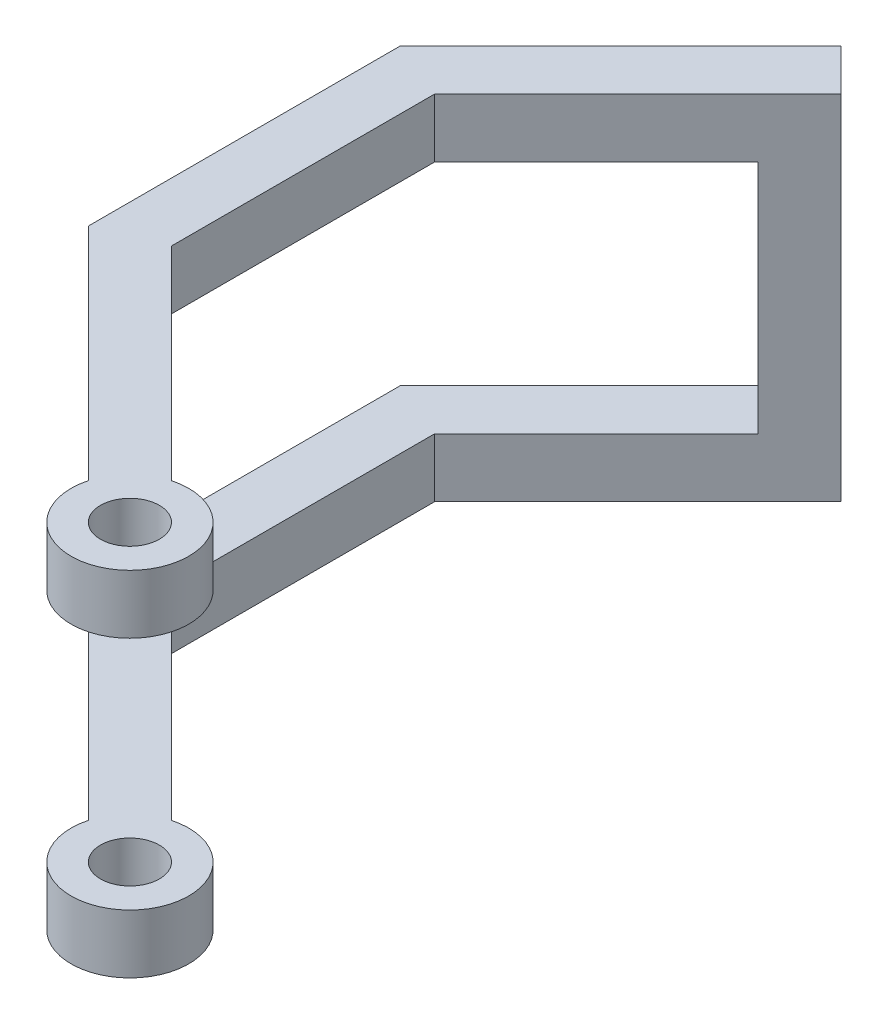
ISO-10303-21;
HEADER;
FILE_DESCRIPTION(('STEP AP214'),'2;1');
FILE_NAME('part.step','',(''),(''),'','','');
FILE_SCHEMA(('AUTOMOTIVE_DESIGN { 1 0 10303 214 1 1 1 1 }'));
ENDSEC;
DATA;
#1=APPLICATION_CONTEXT('core data for automotive mechanical design processes');
#2=APPLICATION_PROTOCOL_DEFINITION('international standard','automotive_design',2000,#1);
#3=PRODUCT_CONTEXT('',#1,'mechanical');
#4=PRODUCT('Part','Part','',(#3));
#5=PRODUCT_RELATED_PRODUCT_CATEGORY('part','',(#4));
#6=PRODUCT_DEFINITION_FORMATION('','',#4);
#7=PRODUCT_DEFINITION_CONTEXT('part definition',#1,'design');
#8=PRODUCT_DEFINITION('design','',#6,#7);
#9=PRODUCT_DEFINITION_SHAPE('','',#8);
#10=(LENGTH_UNIT() NAMED_UNIT(*) SI_UNIT(.MILLI.,.METRE.));
#11=(NAMED_UNIT(*) PLANE_ANGLE_UNIT() SI_UNIT($,.RADIAN.));
#12=(NAMED_UNIT(*) SI_UNIT($,.STERADIAN.) SOLID_ANGLE_UNIT());
#13=UNCERTAINTY_MEASURE_WITH_UNIT(LENGTH_MEASURE(1.E-05),#10,'distance_accuracy_value','');
#14=(GEOMETRIC_REPRESENTATION_CONTEXT(3) GLOBAL_UNCERTAINTY_ASSIGNED_CONTEXT((#13)) GLOBAL_UNIT_ASSIGNED_CONTEXT((#10,
#11,#12)) REPRESENTATION_CONTEXT('',''));
#15=CARTESIAN_POINT('',(0.,0.,0.));
#16=DIRECTION('',(0.,0.,1.));
#17=DIRECTION('',(1.,0.,0.));
#18=AXIS2_PLACEMENT_3D('',#15,#16,#17);
#19=CARTESIAN_POINT('',(9.65925826289067,60.,2.58819045102526));
#20=DIRECTION('',(0.,1.,0.));
#21=DIRECTION('',(0.,0.,1.));
#22=AXIS2_PLACEMENT_3D('',#19,#20,#21);
#23=PLANE('',#22);
#24=CARTESIAN_POINT('',(9.65925826289067,60.,2.58819045102526));
#25=DIRECTION('',(0.,1.,0.));
#26=DIRECTION('',(0.,0.,1.));
#27=AXIS2_PLACEMENT_3D('',#24,#25,#26);
#28=CIRCLE('',#27,10.);
#29=CARTESIAN_POINT('',(0.,60.,0.));
#30=VERTEX_POINT('',#29);
#31=CARTESIAN_POINT('',(7.07106781186551,60.,-7.07106781186544));
#32=VERTEX_POINT('',#31);
#33=EDGE_CURVE('E196',#30,#32,#28,.T.);
#34=ORIENTED_EDGE('',*,*,#33,.T.);
#35=DIRECTION('',(-0.707106781186549,0.,-0.707106781186546));
#36=VECTOR('',#35,1.);
#37=CARTESIAN_POINT('',(7.07106781186551,60.,-7.07106781186544));
#38=LINE('',#37,#36);
#39=CARTESIAN_POINT('',(-27.4766594028869,60.,-41.6187950266178));
#40=VERTEX_POINT('',#39);
#41=EDGE_CURVE('E213',#32,#40,#38,.T.);
#42=ORIENTED_EDGE('',*,*,#41,.T.);
#43=DIRECTION('',(0.,0.,-1.));
#44=VECTOR('',#43,1.);
#45=CARTESIAN_POINT('',(-27.4766594028869,60.,-41.6187950266178));
#46=LINE('',#45,#44);
#47=CARTESIAN_POINT('',(-27.4766594028869,60.,-86.3345237791561));
#48=VERTEX_POINT('',#47);
#49=EDGE_CURVE('E211',#40,#48,#46,.T.);
#50=ORIENTED_EDGE('',*,*,#49,.T.);
#51=DIRECTION('',(0.707106781186549,0.,-0.707106781186547));
#52=VECTOR('',#51,1.);
#53=CARTESIAN_POINT('',(7.07106781186563,60.,-120.882250993909));
#54=LINE('',#53,#52);
#55=CARTESIAN_POINT('',(7.07106781186563,60.,-120.882250993909));
#56=VERTEX_POINT('',#55);
#57=EDGE_CURVE('E209',#48,#56,#54,.T.);
#58=ORIENTED_EDGE('',*,*,#57,.T.);
#59=DIRECTION('',(-0.707106781186546,0.,-0.707106781186549));
#60=VECTOR('',#59,1.);
#61=CARTESIAN_POINT('',(1.66533453693774E-13,60.,-127.953318805774));
#62=LINE('',#61,#60);
#63=CARTESIAN_POINT('',(1.66533453693774E-13,60.,-127.953318805774));
#64=VERTEX_POINT('',#63);
#65=EDGE_CURVE('E207',#56,#64,#62,.T.);
#66=ORIENTED_EDGE('',*,*,#65,.T.);
#67=DIRECTION('',(-0.707106781186549,0.,0.707106781186546));
#68=VECTOR('',#67,1.);
#69=CARTESIAN_POINT('',(-37.4766594028869,60.,-90.4766594028871));
#70=LINE('',#69,#68);
#71=CARTESIAN_POINT('',(-37.4766594028869,60.,-90.4766594028871));
#72=VERTEX_POINT('',#71);
#73=EDGE_CURVE('E205',#64,#72,#70,.T.);
#74=ORIENTED_EDGE('',*,*,#73,.T.);
#75=DIRECTION('',(0.,0.,1.));
#76=VECTOR('',#75,1.);
#77=CARTESIAN_POINT('',(-37.476659402887,60.,-37.4766594028871));
#78=LINE('',#77,#76);
#79=CARTESIAN_POINT('',(-37.476659402887,60.,-37.4766594028871));
#80=VERTEX_POINT('',#79);
#81=EDGE_CURVE('E203',#72,#80,#78,.T.);
#82=ORIENTED_EDGE('',*,*,#81,.T.);
#83=DIRECTION('',(0.707106781186546,0.,0.707106781186549));
#84=VECTOR('',#83,1.);
#85=CARTESIAN_POINT('',(0.,60.,0.));
#86=LINE('',#85,#84);
#87=EDGE_CURVE('E200',#80,#30,#86,.T.);
#88=ORIENTED_EDGE('',*,*,#87,.T.);
#89=EDGE_LOOP('',(#34,#42,#50,#58,#66,#74,#82,#88));
#90=FACE_BOUND('',#89,.T.);
#91=CARTESIAN_POINT('',(9.65925826289067,60.,2.58819045102526));
#92=DIRECTION('',(0.,1.,0.));
#93=DIRECTION('',(0.,0.,1.));
#94=AXIS2_PLACEMENT_3D('',#91,#92,#93);
#95=CIRCLE('',#94,5.);
#96=CARTESIAN_POINT('',(9.65925826289067,60.,7.58819045102526));
#97=VERTEX_POINT('',#96);
#98=EDGE_CURVE('E199',#97,#97,#95,.T.);
#99=ORIENTED_EDGE('',*,*,#98,.F.);
#100=EDGE_LOOP('',(#99));
#101=FACE_BOUND('',#100,.T.);
#102=ADVANCED_FACE('F35',(#90,#101),#23,.T.);
#103=CARTESIAN_POINT('',(9.65925826289067,60.,2.58819045102526));
#104=DIRECTION('',(0.,-1.,0.));
#105=DIRECTION('',(0.,0.,-1.));
#106=AXIS2_PLACEMENT_3D('',#103,#104,#105);
#107=CYLINDRICAL_SURFACE('',#106,10.);
#108=CARTESIAN_POINT('',(9.65925826289067,50.,2.58819045102526));
#109=DIRECTION('',(0.,1.,0.));
#110=DIRECTION('',(0.,0.,1.));
#111=AXIS2_PLACEMENT_3D('',#108,#109,#110);
#112=CIRCLE('',#111,10.);
#113=CARTESIAN_POINT('',(0.,50.,0.));
#114=VERTEX_POINT('',#113);
#115=CARTESIAN_POINT('',(7.07106781186551,50.,-7.07106781186544));
#116=VERTEX_POINT('',#115);
#117=EDGE_CURVE('E202',#114,#116,#112,.T.);
#118=ORIENTED_EDGE('',*,*,#117,.T.);
#119=DIRECTION('',(0.,-1.,0.));
#120=VECTOR('',#119,1.);
#121=CARTESIAN_POINT('',(7.07106781186551,60.,-7.07106781186544));
#122=LINE('',#121,#120);
#123=EDGE_CURVE('E235',#32,#116,#122,.T.);
#124=ORIENTED_EDGE('',*,*,#123,.F.);
#125=ORIENTED_EDGE('',*,*,#33,.F.);
#126=DIRECTION('',(0.,-1.,0.));
#127=VECTOR('',#126,1.);
#128=CARTESIAN_POINT('',(0.,60.,0.));
#129=LINE('',#128,#127);
#130=EDGE_CURVE('E39',#30,#114,#129,.T.);
#131=ORIENTED_EDGE('',*,*,#130,.T.);
#132=EDGE_LOOP('',(#118,#124,#125,#131));
#133=FACE_BOUND('',#132,.T.);
#134=ADVANCED_FACE('F265',(#133),#107,.T.);
#135=CARTESIAN_POINT('',(7.07106781186551,60.,-7.07106781186544));
#136=DIRECTION('',(-0.707106781186546,0.,0.707106781186549));
#137=DIRECTION('',(0.707106781186549,0.,0.707106781186546));
#138=AXIS2_PLACEMENT_3D('',#135,#136,#137);
#139=PLANE('',#138);
#140=ORIENTED_EDGE('',*,*,#123,.T.);
#141=DIRECTION('',(-0.707106781186549,0.,-0.707106781186546));
#142=VECTOR('',#141,1.);
#143=CARTESIAN_POINT('',(7.07106781186551,50.,-7.07106781186544));
#144=LINE('',#143,#142);
#145=CARTESIAN_POINT('',(-27.4766594028869,50.,-41.6187950266178));
#146=VERTEX_POINT('',#145);
#147=EDGE_CURVE('E232',#116,#146,#144,.T.);
#148=ORIENTED_EDGE('',*,*,#147,.T.);
#149=DIRECTION('',(0.,-1.,0.));
#150=VECTOR('',#149,1.);
#151=CARTESIAN_POINT('',(-27.4766594028869,60.,-41.6187950266178));
#152=LINE('',#151,#150);
#153=EDGE_CURVE('E231',#40,#146,#152,.T.);
#154=ORIENTED_EDGE('',*,*,#153,.F.);
#155=ORIENTED_EDGE('',*,*,#41,.F.);
#156=EDGE_LOOP('',(#140,#148,#154,#155));
#157=FACE_BOUND('',#156,.T.);
#158=ADVANCED_FACE('F340',(#157),#139,.F.);
#159=CARTESIAN_POINT('',(-27.4766594028869,60.,-41.6187950266178));
#160=DIRECTION('',(-1.,0.,0.));
#161=DIRECTION('',(0.,0.,1.));
#162=AXIS2_PLACEMENT_3D('',#159,#160,#161);
#163=PLANE('',#162);
#164=ORIENTED_EDGE('',*,*,#153,.T.);
#165=DIRECTION('',(0.,0.,-1.));
#166=VECTOR('',#165,1.);
#167=CARTESIAN_POINT('',(-27.4766594028869,50.,-41.6187950266178));
#168=LINE('',#167,#166);
#169=CARTESIAN_POINT('',(-27.4766594028869,50.,-86.3345237791561));
#170=VERTEX_POINT('',#169);
#171=EDGE_CURVE('E228',#146,#170,#168,.T.);
#172=ORIENTED_EDGE('',*,*,#171,.T.);
#173=DIRECTION('',(0.,-1.,0.));
#174=VECTOR('',#173,1.);
#175=CARTESIAN_POINT('',(-27.4766594028869,60.,-86.3345237791561));
#176=LINE('',#175,#174);
#177=EDGE_CURVE('E227',#48,#170,#176,.T.);
#178=ORIENTED_EDGE('',*,*,#177,.F.);
#179=ORIENTED_EDGE('',*,*,#49,.F.);
#180=EDGE_LOOP('',(#164,#172,#178,#179));
#181=FACE_BOUND('',#180,.T.);
#182=ADVANCED_FACE('F337',(#181),#163,.F.);
#183=CARTESIAN_POINT('',(7.07106781186563,60.,-120.882250993909));
#184=DIRECTION('',(-0.707106781186547,0.,-0.707106781186549));
#185=DIRECTION('',(-0.707106781186549,0.,0.707106781186547));
#186=AXIS2_PLACEMENT_3D('',#183,#184,#185);
#187=PLANE('',#186);
#188=ORIENTED_EDGE('',*,*,#177,.T.);
#189=DIRECTION('',(0.707106781186549,0.,-0.707106781186547));
#190=VECTOR('',#189,1.);
#191=CARTESIAN_POINT('',(7.07106781186563,50.,-120.882250993909));
#192=LINE('',#191,#190);
#193=CARTESIAN_POINT('',(0.,50.,-113.811183182043));
#194=VERTEX_POINT('',#193);
#195=EDGE_CURVE('E223',#170,#194,#192,.T.);
#196=ORIENTED_EDGE('',*,*,#195,.T.);
#197=DIRECTION('',(0.,-1.,0.));
#198=VECTOR('',#197,1.);
#199=CARTESIAN_POINT('',(0.,50.,-113.811183182043));
#200=LINE('',#199,#198);
#201=CARTESIAN_POINT('',(0.,10.,-113.811183182043));
#202=VERTEX_POINT('',#201);
#203=EDGE_CURVE('E52',#194,#202,#200,.T.);
#204=ORIENTED_EDGE('',*,*,#203,.T.);
#205=DIRECTION('',(0.707106781186549,0.,-0.707106781186547));
#206=VECTOR('',#205,1.);
#207=CARTESIAN_POINT('',(7.07106781186563,10.,-120.882250993909));
#208=LINE('',#207,#206);
#209=CARTESIAN_POINT('',(-27.4766594028869,10.,-86.3345237791561));
#210=VERTEX_POINT('',#209);
#211=EDGE_CURVE('E161',#210,#202,#208,.T.);
#212=ORIENTED_EDGE('',*,*,#211,.F.);
#213=DIRECTION('',(0.,-1.,0.));
#214=VECTOR('',#213,1.);
#215=CARTESIAN_POINT('',(-27.4766594028869,60.,-86.3345237791561));
#216=LINE('',#215,#214);
#217=CARTESIAN_POINT('',(-27.4766594028869,0.,-86.3345237791561));
#218=VERTEX_POINT('',#217);
#219=EDGE_CURVE('E176',#210,#218,#216,.T.);
#220=ORIENTED_EDGE('',*,*,#219,.T.);
#221=DIRECTION('',(0.707106781186549,0.,-0.707106781186547));
#222=VECTOR('',#221,1.);
#223=CARTESIAN_POINT('',(7.07106781186563,0.,-120.882250993909));
#224=LINE('',#223,#222);
#225=CARTESIAN_POINT('',(7.07106781186563,0.,-120.882250993909));
#226=VERTEX_POINT('',#225);
#227=EDGE_CURVE('E282',#218,#226,#224,.T.);
#228=ORIENTED_EDGE('',*,*,#227,.T.);
#229=DIRECTION('',(0.,-1.,0.));
#230=VECTOR('',#229,1.);
#231=CARTESIAN_POINT('',(7.07106781186563,60.,-120.882250993909));
#232=LINE('',#231,#230);
#233=EDGE_CURVE('E226',#56,#226,#232,.T.);
#234=ORIENTED_EDGE('',*,*,#233,.F.);
#235=ORIENTED_EDGE('',*,*,#57,.F.);
#236=EDGE_LOOP('',(#188,#196,#204,#212,#220,#228,#234,#235));
#237=FACE_BOUND('',#236,.T.);
#238=ADVANCED_FACE('F316',(#237),#187,.F.);
#239=CARTESIAN_POINT('',(1.66533453693774E-13,60.,-127.953318805774));
#240=DIRECTION('',(-0.707106781186549,0.,0.707106781186546));
#241=DIRECTION('',(0.707106781186546,0.,0.707106781186549));
#242=AXIS2_PLACEMENT_3D('',#239,#240,#241);
#243=PLANE('',#242);
#244=ORIENTED_EDGE('',*,*,#233,.T.);
#245=DIRECTION('',(-0.707106781186546,0.,-0.707106781186549));
#246=VECTOR('',#245,1.);
#247=CARTESIAN_POINT('',(1.66533453693774E-13,0.,-127.953318805774));
#248=LINE('',#247,#246);
#249=CARTESIAN_POINT('',(1.66533453693774E-13,0.,-127.953318805774));
#250=VERTEX_POINT('',#249);
#251=EDGE_CURVE('E276',#226,#250,#248,.T.);
#252=ORIENTED_EDGE('',*,*,#251,.T.);
#253=DIRECTION('',(0.,-1.,0.));
#254=VECTOR('',#253,1.);
#255=CARTESIAN_POINT('',(1.66533453693774E-13,60.,-127.953318805774));
#256=LINE('',#255,#254);
#257=EDGE_CURVE('E222',#64,#250,#256,.T.);
#258=ORIENTED_EDGE('',*,*,#257,.F.);
#259=ORIENTED_EDGE('',*,*,#65,.F.);
#260=EDGE_LOOP('',(#244,#252,#258,#259));
#261=FACE_BOUND('',#260,.T.);
#262=ADVANCED_FACE('F277',(#261),#243,.F.);
#263=CARTESIAN_POINT('',(-37.4766594028869,60.,-90.4766594028871));
#264=DIRECTION('',(0.707106781186546,0.,0.707106781186549));
#265=DIRECTION('',(0.707106781186549,0.,-0.707106781186546));
#266=AXIS2_PLACEMENT_3D('',#263,#264,#265);
#267=PLANE('',#266);
#268=ORIENTED_EDGE('',*,*,#257,.T.);
#269=DIRECTION('',(-0.707106781186549,0.,0.707106781186546));
#270=VECTOR('',#269,1.);
#271=CARTESIAN_POINT('',(-37.4766594028869,0.,-90.4766594028871));
#272=LINE('',#271,#270);
#273=CARTESIAN_POINT('',(-37.4766594028869,0.,-90.4766594028871));
#274=VERTEX_POINT('',#273);
#275=EDGE_CURVE('E174',#250,#274,#272,.T.);
#276=ORIENTED_EDGE('',*,*,#275,.T.);
#277=DIRECTION('',(0.,-1.,0.));
#278=VECTOR('',#277,1.);
#279=CARTESIAN_POINT('',(-37.4766594028869,60.,-90.4766594028871));
#280=LINE('',#279,#278);
#281=CARTESIAN_POINT('',(-37.4766594028869,10.,-90.4766594028871));
#282=VERTEX_POINT('',#281);
#283=EDGE_CURVE('E167',#282,#274,#280,.T.);
#284=ORIENTED_EDGE('',*,*,#283,.F.);
#285=DIRECTION('',(-0.707106781186549,0.,0.707106781186546));
#286=VECTOR('',#285,1.);
#287=CARTESIAN_POINT('',(-37.4766594028869,10.,-90.4766594028871));
#288=LINE('',#287,#286);
#289=CARTESIAN_POINT('',(-7.07106781186546,10.,-120.882250993908));
#290=VERTEX_POINT('',#289);
#291=EDGE_CURVE('E151',#290,#282,#288,.T.);
#292=ORIENTED_EDGE('',*,*,#291,.F.);
#293=DIRECTION('',(0.,-1.,0.));
#294=VECTOR('',#293,1.);
#295=CARTESIAN_POINT('',(-7.07106781186545,50.,-120.882250993908));
#296=LINE('',#295,#294);
#297=CARTESIAN_POINT('',(-7.07106781186545,50.,-120.882250993908));
#298=VERTEX_POINT('',#297);
#299=EDGE_CURVE('E194',#298,#290,#296,.T.);
#300=ORIENTED_EDGE('',*,*,#299,.F.);
#301=DIRECTION('',(-0.707106781186549,0.,0.707106781186546));
#302=VECTOR('',#301,1.);
#303=CARTESIAN_POINT('',(-37.4766594028869,50.,-90.4766594028871));
#304=LINE('',#303,#302);
#305=CARTESIAN_POINT('',(-37.4766594028869,50.,-90.4766594028871));
#306=VERTEX_POINT('',#305);
#307=EDGE_CURVE('E61',#298,#306,#304,.T.);
#308=ORIENTED_EDGE('',*,*,#307,.T.);
#309=DIRECTION('',(0.,-1.,0.));
#310=VECTOR('',#309,1.);
#311=CARTESIAN_POINT('',(-37.4766594028869,60.,-90.4766594028871));
#312=LINE('',#311,#310);
#313=EDGE_CURVE('E221',#72,#306,#312,.T.);
#314=ORIENTED_EDGE('',*,*,#313,.F.);
#315=ORIENTED_EDGE('',*,*,#73,.F.);
#316=EDGE_LOOP('',(#268,#276,#284,#292,#300,#308,#314,#315));
#317=FACE_BOUND('',#316,.T.);
#318=ADVANCED_FACE('F172',(#317),#267,.F.);
#319=CARTESIAN_POINT('',(-37.476659402887,60.,-37.4766594028871));
#320=DIRECTION('',(1.,0.,0.));
#321=DIRECTION('',(0.,0.,-1.));
#322=AXIS2_PLACEMENT_3D('',#319,#320,#321);
#323=PLANE('',#322);
#324=ORIENTED_EDGE('',*,*,#313,.T.);
#325=DIRECTION('',(0.,0.,-1.));
#326=VECTOR('',#325,1.);
#327=CARTESIAN_POINT('',(-37.476659402887,50.,0.));
#328=LINE('',#327,#326);
#329=CARTESIAN_POINT('',(-37.476659402887,50.,-37.4766594028871));
#330=VERTEX_POINT('',#329);
#331=EDGE_CURVE('E11',#330,#306,#328,.T.);
#332=ORIENTED_EDGE('',*,*,#331,.F.);
#333=DIRECTION('',(0.,-1.,0.));
#334=VECTOR('',#333,1.);
#335=CARTESIAN_POINT('',(-37.476659402887,60.,-37.4766594028871));
#336=LINE('',#335,#334);
#337=EDGE_CURVE('E238',#80,#330,#336,.T.);
#338=ORIENTED_EDGE('',*,*,#337,.F.);
#339=ORIENTED_EDGE('',*,*,#81,.F.);
#340=EDGE_LOOP('',(#324,#332,#338,#339));
#341=FACE_BOUND('',#340,.T.);
#342=ADVANCED_FACE('F259',(#341),#323,.F.);
#343=CARTESIAN_POINT('',(0.,60.,0.));
#344=DIRECTION('',(0.707106781186549,0.,-0.707106781186546));
#345=DIRECTION('',(-0.707106781186546,0.,-0.707106781186549));
#346=AXIS2_PLACEMENT_3D('',#343,#344,#345);
#347=PLANE('',#346);
#348=ORIENTED_EDGE('',*,*,#337,.T.);
#349=DIRECTION('',(0.707106781186546,0.,0.707106781186549));
#350=VECTOR('',#349,1.);
#351=CARTESIAN_POINT('',(0.,50.,0.));
#352=LINE('',#351,#350);
#353=EDGE_CURVE('E219',#330,#114,#352,.T.);
#354=ORIENTED_EDGE('',*,*,#353,.T.);
#355=ORIENTED_EDGE('',*,*,#130,.F.);
#356=ORIENTED_EDGE('',*,*,#87,.F.);
#357=EDGE_LOOP('',(#348,#354,#355,#356));
#358=FACE_BOUND('',#357,.T.);
#359=ADVANCED_FACE('F253',(#358),#347,.F.);
#360=CARTESIAN_POINT('',(9.65925826289067,60.,2.58819045102526));
#361=DIRECTION('',(0.,-1.,0.));
#362=DIRECTION('',(0.,0.,-1.));
#363=AXIS2_PLACEMENT_3D('',#360,#361,#362);
#364=CYLINDRICAL_SURFACE('',#363,5.);
#365=CARTESIAN_POINT('',(9.65925826289067,50.,2.58819045102526));
#366=DIRECTION('',(0.,1.,0.));
#367=DIRECTION('',(0.,0.,1.));
#368=AXIS2_PLACEMENT_3D('',#365,#366,#367);
#369=CIRCLE('',#368,5.);
#370=CARTESIAN_POINT('',(9.65925826289067,50.,7.58819045102526));
#371=VERTEX_POINT('',#370);
#372=EDGE_CURVE('E44',#371,#371,#369,.T.);
#373=ORIENTED_EDGE('',*,*,#372,.F.);
#374=EDGE_LOOP('',(#373));
#375=FACE_BOUND('',#374,.T.);
#376=ORIENTED_EDGE('',*,*,#98,.T.);
#377=EDGE_LOOP('',(#376));
#378=FACE_BOUND('',#377,.T.);
#379=ADVANCED_FACE('F37',(#375,#378),#364,.F.);
#380=CARTESIAN_POINT('',(20.5233405971131,50.,0.));
#381=DIRECTION('',(0.,1.,0.));
#382=DIRECTION('',(0.,0.,1.));
#383=AXIS2_PLACEMENT_3D('',#380,#381,#382);
#384=PLANE('',#383);
#385=ORIENTED_EDGE('',*,*,#372,.T.);
#386=EDGE_LOOP('',(#385));
#387=FACE_BOUND('',#386,.T.);
#388=ORIENTED_EDGE('',*,*,#307,.F.);
#389=DIRECTION('',(0.707106781186547,0.,0.707106781186548));
#390=VECTOR('',#389,1.);
#391=CARTESIAN_POINT('',(0.,50.,-113.811183182043));
#392=LINE('',#391,#390);
#393=EDGE_CURVE('E190',#298,#194,#392,.T.);
#394=ORIENTED_EDGE('',*,*,#393,.T.);
#395=ORIENTED_EDGE('',*,*,#195,.F.);
#396=ORIENTED_EDGE('',*,*,#171,.F.);
#397=ORIENTED_EDGE('',*,*,#147,.F.);
#398=ORIENTED_EDGE('',*,*,#117,.F.);
#399=ORIENTED_EDGE('',*,*,#353,.F.);
#400=ORIENTED_EDGE('',*,*,#331,.T.);
#401=EDGE_LOOP('',(#388,#394,#395,#396,#397,#398,#399,#400));
#402=FACE_BOUND('',#401,.T.);
#403=ADVANCED_FACE('F261',(#387,#402),#384,.F.);
#404=CARTESIAN_POINT('',(0.,50.,-113.811183182043));
#405=DIRECTION('',(0.707106781186548,0.,-0.707106781186547));
#406=DIRECTION('',(-0.707106781186547,0.,-0.707106781186548));
#407=AXIS2_PLACEMENT_3D('',#404,#405,#406);
#408=PLANE('',#407);
#409=DIRECTION('',(0.707106781186547,0.,0.707106781186548));
#410=VECTOR('',#409,1.);
#411=CARTESIAN_POINT('',(0.,10.,-113.811183182043));
#412=LINE('',#411,#410);
#413=EDGE_CURVE('E157',#290,#202,#412,.T.);
#414=ORIENTED_EDGE('',*,*,#413,.T.);
#415=ORIENTED_EDGE('',*,*,#203,.F.);
#416=ORIENTED_EDGE('',*,*,#393,.F.);
#417=ORIENTED_EDGE('',*,*,#299,.T.);
#418=EDGE_LOOP('',(#414,#415,#416,#417));
#419=FACE_BOUND('',#418,.T.);
#420=ADVANCED_FACE('F334',(#419),#408,.F.);
#421=CARTESIAN_POINT('',(20.5233405971131,10.,0.));
#422=DIRECTION('',(0.,1.,0.));
#423=DIRECTION('',(0.,0.,1.));
#424=AXIS2_PLACEMENT_3D('',#421,#422,#423);
#425=PLANE('',#424);
#426=CARTESIAN_POINT('',(9.65925826289067,10.,2.58819045102526));
#427=DIRECTION('',(0.,1.,0.));
#428=DIRECTION('',(0.,0.,1.));
#429=AXIS2_PLACEMENT_3D('',#426,#427,#428);
#430=CIRCLE('',#429,5.);
#431=CARTESIAN_POINT('',(9.65925826289067,10.,7.58819045102526));
#432=VERTEX_POINT('',#431);
#433=EDGE_CURVE('E170',#432,#432,#430,.T.);
#434=ORIENTED_EDGE('',*,*,#433,.F.);
#435=EDGE_LOOP('',(#434));
#436=FACE_BOUND('',#435,.T.);
#437=ORIENTED_EDGE('',*,*,#413,.F.);
#438=ORIENTED_EDGE('',*,*,#291,.T.);
#439=DIRECTION('',(0.,0.,-1.));
#440=VECTOR('',#439,1.);
#441=CARTESIAN_POINT('',(-37.476659402887,10.,0.));
#442=LINE('',#441,#440);
#443=CARTESIAN_POINT('',(-37.476659402887,10.,-37.4766594028871));
#444=VERTEX_POINT('',#443);
#445=EDGE_CURVE('E155',#444,#282,#442,.T.);
#446=ORIENTED_EDGE('',*,*,#445,.F.);
#447=DIRECTION('',(0.707106781186546,0.,0.707106781186549));
#448=VECTOR('',#447,1.);
#449=CARTESIAN_POINT('',(0.,10.,0.));
#450=LINE('',#449,#448);
#451=CARTESIAN_POINT('',(0.,10.,0.));
#452=VERTEX_POINT('',#451);
#453=EDGE_CURVE('E189',#444,#452,#450,.T.);
#454=ORIENTED_EDGE('',*,*,#453,.T.);
#455=CARTESIAN_POINT('',(9.65925826289067,10.,2.58819045102526));
#456=DIRECTION('',(0.,1.,0.));
#457=DIRECTION('',(0.,0.,1.));
#458=AXIS2_PLACEMENT_3D('',#455,#456,#457);
#459=CIRCLE('',#458,10.);
#460=CARTESIAN_POINT('',(7.07106781186551,10.,-7.07106781186544));
#461=VERTEX_POINT('',#460);
#462=EDGE_CURVE('E301',#452,#461,#459,.T.);
#463=ORIENTED_EDGE('',*,*,#462,.T.);
#464=DIRECTION('',(-0.707106781186549,0.,-0.707106781186546));
#465=VECTOR('',#464,1.);
#466=CARTESIAN_POINT('',(7.07106781186551,10.,-7.07106781186544));
#467=LINE('',#466,#465);
#468=CARTESIAN_POINT('',(-27.4766594028869,10.,-41.6187950266178));
#469=VERTEX_POINT('',#468);
#470=EDGE_CURVE('E328',#461,#469,#467,.T.);
#471=ORIENTED_EDGE('',*,*,#470,.T.);
#472=DIRECTION('',(0.,0.,-1.));
#473=VECTOR('',#472,1.);
#474=CARTESIAN_POINT('',(-27.4766594028869,10.,-41.6187950266178));
#475=LINE('',#474,#473);
#476=EDGE_CURVE('E324',#469,#210,#475,.T.);
#477=ORIENTED_EDGE('',*,*,#476,.T.);
#478=ORIENTED_EDGE('',*,*,#211,.T.);
#479=EDGE_LOOP('',(#437,#438,#446,#454,#463,#471,#477,#478));
#480=FACE_BOUND('',#479,.T.);
#481=ADVANCED_FACE('F153',(#436,#480),#425,.T.);
#482=CARTESIAN_POINT('',(0.,60.,0.));
#483=DIRECTION('',(0.707106781186549,0.,-0.707106781186546));
#484=DIRECTION('',(-0.707106781186546,0.,-0.707106781186549));
#485=AXIS2_PLACEMENT_3D('',#482,#483,#484);
#486=PLANE('',#485);
#487=ORIENTED_EDGE('',*,*,#453,.F.);
#488=DIRECTION('',(0.,-1.,0.));
#489=VECTOR('',#488,1.);
#490=CARTESIAN_POINT('',(-37.476659402887,60.,-37.4766594028871));
#491=LINE('',#490,#489);
#492=CARTESIAN_POINT('',(-37.476659402887,0.,-37.4766594028871));
#493=VERTEX_POINT('',#492);
#494=EDGE_CURVE('E169',#444,#493,#491,.T.);
#495=ORIENTED_EDGE('',*,*,#494,.T.);
#496=DIRECTION('',(0.707106781186546,0.,0.707106781186549));
#497=VECTOR('',#496,1.);
#498=CARTESIAN_POINT('',(0.,0.,0.));
#499=LINE('',#498,#497);
#500=CARTESIAN_POINT('',(0.,0.,0.));
#501=VERTEX_POINT('',#500);
#502=EDGE_CURVE('E290',#493,#501,#499,.T.);
#503=ORIENTED_EDGE('',*,*,#502,.T.);
#504=DIRECTION('',(0.,-1.,0.));
#505=VECTOR('',#504,1.);
#506=CARTESIAN_POINT('',(0.,60.,0.));
#507=LINE('',#506,#505);
#508=EDGE_CURVE('E180',#452,#501,#507,.T.);
#509=ORIENTED_EDGE('',*,*,#508,.F.);
#510=EDGE_LOOP('',(#487,#495,#503,#509));
#511=FACE_BOUND('',#510,.T.);
#512=ADVANCED_FACE('F303',(#511),#486,.F.);
#513=CARTESIAN_POINT('',(-37.476659402887,60.,-37.4766594028871));
#514=DIRECTION('',(1.,0.,0.));
#515=DIRECTION('',(0.,0.,-1.));
#516=AXIS2_PLACEMENT_3D('',#513,#514,#515);
#517=PLANE('',#516);
#518=ORIENTED_EDGE('',*,*,#445,.T.);
#519=ORIENTED_EDGE('',*,*,#283,.T.);
#520=DIRECTION('',(0.,0.,1.));
#521=VECTOR('',#520,1.);
#522=CARTESIAN_POINT('',(-37.476659402887,0.,-37.4766594028871));
#523=LINE('',#522,#521);
#524=EDGE_CURVE('E288',#274,#493,#523,.T.);
#525=ORIENTED_EDGE('',*,*,#524,.T.);
#526=ORIENTED_EDGE('',*,*,#494,.F.);
#527=EDGE_LOOP('',(#518,#519,#525,#526));
#528=FACE_BOUND('',#527,.T.);
#529=ADVANCED_FACE('F165',(#528),#517,.F.);
#530=CARTESIAN_POINT('',(-27.4766594028869,60.,-41.6187950266178));
#531=DIRECTION('',(-1.,0.,0.));
#532=DIRECTION('',(0.,0.,1.));
#533=AXIS2_PLACEMENT_3D('',#530,#531,#532);
#534=PLANE('',#533);
#535=ORIENTED_EDGE('',*,*,#476,.F.);
#536=DIRECTION('',(0.,-1.,0.));
#537=VECTOR('',#536,1.);
#538=CARTESIAN_POINT('',(-27.4766594028869,60.,-41.6187950266178));
#539=LINE('',#538,#537);
#540=CARTESIAN_POINT('',(-27.4766594028869,0.,-41.6187950266178));
#541=VERTEX_POINT('',#540);
#542=EDGE_CURVE('E178',#469,#541,#539,.T.);
#543=ORIENTED_EDGE('',*,*,#542,.T.);
#544=DIRECTION('',(0.,0.,-1.));
#545=VECTOR('',#544,1.);
#546=CARTESIAN_POINT('',(-27.4766594028869,0.,-41.6187950266178));
#547=LINE('',#546,#545);
#548=EDGE_CURVE('E309',#541,#218,#547,.T.);
#549=ORIENTED_EDGE('',*,*,#548,.T.);
#550=ORIENTED_EDGE('',*,*,#219,.F.);
#551=EDGE_LOOP('',(#535,#543,#549,#550));
#552=FACE_BOUND('',#551,.T.);
#553=ADVANCED_FACE('F322',(#552),#534,.F.);
#554=CARTESIAN_POINT('',(7.07106781186551,60.,-7.07106781186544));
#555=DIRECTION('',(-0.707106781186546,0.,0.707106781186549));
#556=DIRECTION('',(0.707106781186549,0.,0.707106781186546));
#557=AXIS2_PLACEMENT_3D('',#554,#555,#556);
#558=PLANE('',#557);
#559=ORIENTED_EDGE('',*,*,#470,.F.);
#560=DIRECTION('',(0.,-1.,0.));
#561=VECTOR('',#560,1.);
#562=CARTESIAN_POINT('',(7.07106781186551,60.,-7.07106781186544));
#563=LINE('',#562,#561);
#564=CARTESIAN_POINT('',(7.07106781186551,0.,-7.07106781186544));
#565=VERTEX_POINT('',#564);
#566=EDGE_CURVE('E185',#461,#565,#563,.T.);
#567=ORIENTED_EDGE('',*,*,#566,.T.);
#568=DIRECTION('',(-0.707106781186549,0.,-0.707106781186546));
#569=VECTOR('',#568,1.);
#570=CARTESIAN_POINT('',(7.07106781186551,0.,-7.07106781186544));
#571=LINE('',#570,#569);
#572=EDGE_CURVE('E307',#565,#541,#571,.T.);
#573=ORIENTED_EDGE('',*,*,#572,.T.);
#574=ORIENTED_EDGE('',*,*,#542,.F.);
#575=EDGE_LOOP('',(#559,#567,#573,#574));
#576=FACE_BOUND('',#575,.T.);
#577=ADVANCED_FACE('F327',(#576),#558,.F.);
#578=CARTESIAN_POINT('',(9.65925826289067,60.,2.58819045102526));
#579=DIRECTION('',(0.,-1.,0.));
#580=DIRECTION('',(0.,0.,-1.));
#581=AXIS2_PLACEMENT_3D('',#578,#579,#580);
#582=CYLINDRICAL_SURFACE('',#581,10.);
#583=ORIENTED_EDGE('',*,*,#462,.F.);
#584=ORIENTED_EDGE('',*,*,#508,.T.);
#585=CARTESIAN_POINT('',(9.65925826289067,0.,2.58819045102526));
#586=DIRECTION('',(0.,1.,0.));
#587=DIRECTION('',(0.,0.,1.));
#588=AXIS2_PLACEMENT_3D('',#585,#586,#587);
#589=CIRCLE('',#588,10.);
#590=EDGE_CURVE('E300',#501,#565,#589,.T.);
#591=ORIENTED_EDGE('',*,*,#590,.T.);
#592=ORIENTED_EDGE('',*,*,#566,.F.);
#593=EDGE_LOOP('',(#583,#584,#591,#592));
#594=FACE_BOUND('',#593,.T.);
#595=ADVANCED_FACE('F298',(#594),#582,.T.);
#596=CARTESIAN_POINT('',(9.65925826289067,0.,2.58819045102526));
#597=DIRECTION('',(0.,1.,0.));
#598=DIRECTION('',(0.,0.,1.));
#599=AXIS2_PLACEMENT_3D('',#596,#597,#598);
#600=PLANE('',#599);
#601=ORIENTED_EDGE('',*,*,#590,.F.);
#602=ORIENTED_EDGE('',*,*,#502,.F.);
#603=ORIENTED_EDGE('',*,*,#524,.F.);
#604=ORIENTED_EDGE('',*,*,#275,.F.);
#605=ORIENTED_EDGE('',*,*,#251,.F.);
#606=ORIENTED_EDGE('',*,*,#227,.F.);
#607=ORIENTED_EDGE('',*,*,#548,.F.);
#608=ORIENTED_EDGE('',*,*,#572,.F.);
#609=EDGE_LOOP('',(#601,#602,#603,#604,#605,#606,#607,#608));
#610=FACE_BOUND('',#609,.T.);
#611=CARTESIAN_POINT('',(9.65925826289067,0.,2.58819045102526));
#612=DIRECTION('',(0.,1.,0.));
#613=DIRECTION('',(0.,0.,1.));
#614=AXIS2_PLACEMENT_3D('',#611,#612,#613);
#615=CIRCLE('',#614,5.);
#616=CARTESIAN_POINT('',(9.65925826289067,0.,7.58819045102526));
#617=VERTEX_POINT('',#616);
#618=EDGE_CURVE('E160',#617,#617,#615,.T.);
#619=ORIENTED_EDGE('',*,*,#618,.T.);
#620=EDGE_LOOP('',(#619));
#621=FACE_BOUND('',#620,.T.);
#622=ADVANCED_FACE('F285',(#610,#621),#600,.F.);
#623=CARTESIAN_POINT('',(9.65925826289067,60.,2.58819045102526));
#624=DIRECTION('',(0.,-1.,0.));
#625=DIRECTION('',(0.,0.,-1.));
#626=AXIS2_PLACEMENT_3D('',#623,#624,#625);
#627=CYLINDRICAL_SURFACE('',#626,5.);
#628=ORIENTED_EDGE('',*,*,#618,.F.);
#629=EDGE_LOOP('',(#628));
#630=FACE_BOUND('',#629,.T.);
#631=ORIENTED_EDGE('',*,*,#433,.T.);
#632=EDGE_LOOP('',(#631));
#633=FACE_BOUND('',#632,.T.);
#634=ADVANCED_FACE('F444',(#630,#633),#627,.F.);
#635=CLOSED_SHELL('',(#102,#134,#158,#182,#238,#262,#318,#342,#359,#379,#403,#420,#481,#512,
#529,#553,#577,#595,#622,#634));
#636=MANIFOLD_SOLID_BREP('B2',#635);
#637=ADVANCED_BREP_SHAPE_REPRESENTATION('',(#18,#636),#14);
#638=SHAPE_DEFINITION_REPRESENTATION(#9,#637);
ENDSEC;
END-ISO-10303-21;
